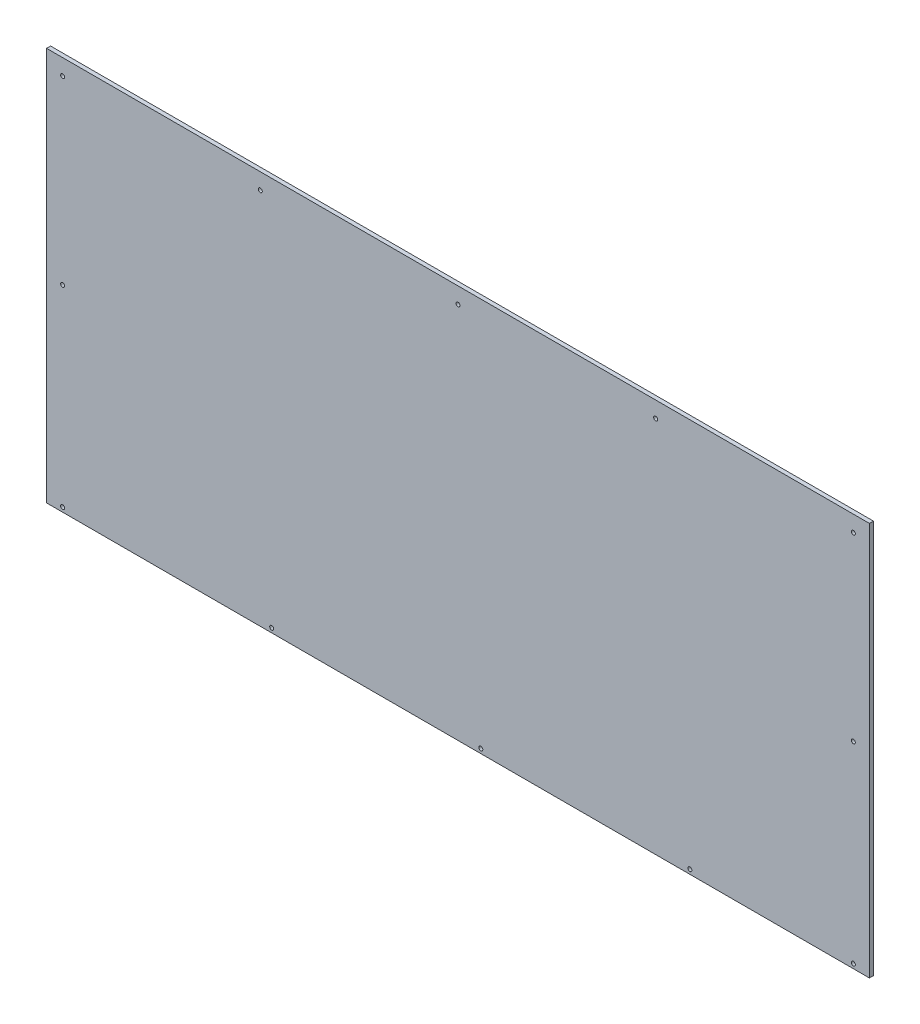
ISO-10303-21;
HEADER;
FILE_DESCRIPTION(('STEP AP214'),'2;1');
FILE_NAME('part.step','',(''),(''),'','','');
FILE_SCHEMA(('AUTOMOTIVE_DESIGN { 1 0 10303 214 1 1 1 1 }'));
ENDSEC;
DATA;
#1=APPLICATION_CONTEXT('core data for automotive mechanical design processes');
#2=APPLICATION_PROTOCOL_DEFINITION('international standard','automotive_design',2000,#1);
#3=PRODUCT_CONTEXT('',#1,'mechanical');
#4=PRODUCT('Part','Part','',(#3));
#5=PRODUCT_RELATED_PRODUCT_CATEGORY('part','',(#4));
#6=PRODUCT_DEFINITION_FORMATION('','',#4);
#7=PRODUCT_DEFINITION_CONTEXT('part definition',#1,'design');
#8=PRODUCT_DEFINITION('design','',#6,#7);
#9=PRODUCT_DEFINITION_SHAPE('','',#8);
#10=(LENGTH_UNIT() NAMED_UNIT(*) SI_UNIT(.MILLI.,.METRE.));
#11=(NAMED_UNIT(*) PLANE_ANGLE_UNIT() SI_UNIT($,.RADIAN.));
#12=(NAMED_UNIT(*) SI_UNIT($,.STERADIAN.) SOLID_ANGLE_UNIT());
#13=UNCERTAINTY_MEASURE_WITH_UNIT(LENGTH_MEASURE(1.E-05),#10,'distance_accuracy_value','');
#14=(GEOMETRIC_REPRESENTATION_CONTEXT(3) GLOBAL_UNCERTAINTY_ASSIGNED_CONTEXT((#13)) GLOBAL_UNIT_ASSIGNED_CONTEXT((#10,
#11,#12)) REPRESENTATION_CONTEXT('',''));
#15=CARTESIAN_POINT('',(0.,0.,0.));
#16=DIRECTION('',(0.,0.,1.));
#17=DIRECTION('',(1.,0.,0.));
#18=AXIS2_PLACEMENT_3D('',#15,#16,#17);
#19=CARTESIAN_POINT('',(650.,311.,6.35));
#20=DIRECTION('',(-1.,0.,0.));
#21=DIRECTION('',(0.,-1.,0.));
#22=AXIS2_PLACEMENT_3D('',#19,#20,#21);
#23=PLANE('',#22);
#24=DIRECTION('',(0.,1.,0.));
#25=VECTOR('',#24,1.);
#26=CARTESIAN_POINT('',(650.,311.,0.));
#27=LINE('',#26,#25);
#28=CARTESIAN_POINT('',(650.,-311.,0.));
#29=VERTEX_POINT('',#28);
#30=CARTESIAN_POINT('',(650.,311.,0.));
#31=VERTEX_POINT('',#30);
#32=EDGE_CURVE('E95',#29,#31,#27,.T.);
#33=ORIENTED_EDGE('',*,*,#32,.T.);
#34=DIRECTION('',(0.,0.,-1.));
#35=VECTOR('',#34,1.);
#36=CARTESIAN_POINT('',(650.,311.,6.35));
#37=LINE('',#36,#35);
#38=CARTESIAN_POINT('',(650.,311.,6.35));
#39=VERTEX_POINT('',#38);
#40=EDGE_CURVE('E11',#39,#31,#37,.T.);
#41=ORIENTED_EDGE('',*,*,#40,.F.);
#42=DIRECTION('',(0.,1.,0.));
#43=VECTOR('',#42,1.);
#44=CARTESIAN_POINT('',(650.,311.,6.35));
#45=LINE('',#44,#43);
#46=CARTESIAN_POINT('',(650.,-311.,6.35));
#47=VERTEX_POINT('',#46);
#48=EDGE_CURVE('E83',#47,#39,#45,.T.);
#49=ORIENTED_EDGE('',*,*,#48,.F.);
#50=DIRECTION('',(0.,0.,-1.));
#51=VECTOR('',#50,1.);
#52=CARTESIAN_POINT('',(650.,-311.,6.35));
#53=LINE('',#52,#51);
#54=EDGE_CURVE('E91',#47,#29,#53,.T.);
#55=ORIENTED_EDGE('',*,*,#54,.T.);
#56=EDGE_LOOP('',(#33,#41,#49,#55));
#57=FACE_BOUND('',#56,.T.);
#58=ADVANCED_FACE('F32',(#57),#23,.F.);
#59=CARTESIAN_POINT('',(-650.,311.,6.35));
#60=DIRECTION('',(0.,-1.,0.));
#61=DIRECTION('',(0.,0.,-1.));
#62=AXIS2_PLACEMENT_3D('',#59,#60,#61);
#63=PLANE('',#62);
#64=DIRECTION('',(-1.,0.,0.));
#65=VECTOR('',#64,1.);
#66=CARTESIAN_POINT('',(-650.,311.,0.));
#67=LINE('',#66,#65);
#68=CARTESIAN_POINT('',(-650.,311.,0.));
#69=VERTEX_POINT('',#68);
#70=EDGE_CURVE('E87',#31,#69,#67,.T.);
#71=ORIENTED_EDGE('',*,*,#70,.T.);
#72=DIRECTION('',(0.,0.,-1.));
#73=VECTOR('',#72,1.);
#74=CARTESIAN_POINT('',(-650.,311.,6.35));
#75=LINE('',#74,#73);
#76=CARTESIAN_POINT('',(-650.,311.,6.35));
#77=VERTEX_POINT('',#76);
#78=EDGE_CURVE('E40',#77,#69,#75,.T.);
#79=ORIENTED_EDGE('',*,*,#78,.F.);
#80=DIRECTION('',(-1.,0.,0.));
#81=VECTOR('',#80,1.);
#82=CARTESIAN_POINT('',(-650.,311.,6.35));
#83=LINE('',#82,#81);
#84=EDGE_CURVE('E78',#39,#77,#83,.T.);
#85=ORIENTED_EDGE('',*,*,#84,.F.);
#86=ORIENTED_EDGE('',*,*,#40,.T.);
#87=EDGE_LOOP('',(#71,#79,#85,#86));
#88=FACE_BOUND('',#87,.T.);
#89=ADVANCED_FACE('F86',(#88),#63,.F.);
#90=CARTESIAN_POINT('',(-650.,311.,6.35));
#91=DIRECTION('',(1.,0.,0.));
#92=DIRECTION('',(0.,1.,0.));
#93=AXIS2_PLACEMENT_3D('',#90,#91,#92);
#94=PLANE('',#93);
#95=DIRECTION('',(0.,-1.,0.));
#96=VECTOR('',#95,1.);
#97=CARTESIAN_POINT('',(-650.,311.,0.));
#98=LINE('',#97,#96);
#99=CARTESIAN_POINT('',(-650.,-311.,0.));
#100=VERTEX_POINT('',#99);
#101=EDGE_CURVE('E65',#69,#100,#98,.T.);
#102=ORIENTED_EDGE('',*,*,#101,.T.);
#103=DIRECTION('',(0.,0.,-1.));
#104=VECTOR('',#103,1.);
#105=CARTESIAN_POINT('',(-650.,-311.,6.35));
#106=LINE('',#105,#104);
#107=CARTESIAN_POINT('',(-650.,-311.,6.35));
#108=VERTEX_POINT('',#107);
#109=EDGE_CURVE('E88',#108,#100,#106,.T.);
#110=ORIENTED_EDGE('',*,*,#109,.F.);
#111=DIRECTION('',(0.,-1.,0.));
#112=VECTOR('',#111,1.);
#113=CARTESIAN_POINT('',(-650.,311.,6.35));
#114=LINE('',#113,#112);
#115=EDGE_CURVE('E81',#77,#108,#114,.T.);
#116=ORIENTED_EDGE('',*,*,#115,.F.);
#117=ORIENTED_EDGE('',*,*,#78,.T.);
#118=EDGE_LOOP('',(#102,#110,#116,#117));
#119=FACE_BOUND('',#118,.T.);
#120=ADVANCED_FACE('F89',(#119),#94,.F.);
#121=CARTESIAN_POINT('',(-650.,-311.,6.35));
#122=DIRECTION('',(0.,1.,0.));
#123=DIRECTION('',(0.,0.,1.));
#124=AXIS2_PLACEMENT_3D('',#121,#122,#123);
#125=PLANE('',#124);
#126=DIRECTION('',(1.,0.,0.));
#127=VECTOR('',#126,1.);
#128=CARTESIAN_POINT('',(-650.,-311.,0.));
#129=LINE('',#128,#127);
#130=EDGE_CURVE('E71',#100,#29,#129,.T.);
#131=ORIENTED_EDGE('',*,*,#130,.T.);
#132=ORIENTED_EDGE('',*,*,#54,.F.);
#133=DIRECTION('',(1.,0.,0.));
#134=VECTOR('',#133,1.);
#135=CARTESIAN_POINT('',(-650.,-311.,6.35));
#136=LINE('',#135,#134);
#137=EDGE_CURVE('E48',#108,#47,#136,.T.);
#138=ORIENTED_EDGE('',*,*,#137,.F.);
#139=ORIENTED_EDGE('',*,*,#109,.T.);
#140=EDGE_LOOP('',(#131,#132,#138,#139));
#141=FACE_BOUND('',#140,.T.);
#142=ADVANCED_FACE('F103',(#141),#125,.F.);
#143=CARTESIAN_POINT('',(0.,0.,6.35));
#144=DIRECTION('',(0.,0.,1.));
#145=DIRECTION('',(1.,0.,0.));
#146=AXIS2_PLACEMENT_3D('',#143,#144,#145);
#147=PLANE('',#146);
#148=CARTESIAN_POINT('',(624.6,0.,6.35));
#149=DIRECTION('',(0.,0.,1.));
#150=DIRECTION('',(-1.,0.,0.));
#151=AXIS2_PLACEMENT_3D('',#148,#149,#150);
#152=CIRCLE('',#151,3.17500000000008);
#153=CARTESIAN_POINT('',(621.425,0.,6.35));
#154=VERTEX_POINT('',#153);
#155=EDGE_CURVE('E158',#154,#154,#152,.T.);
#156=ORIENTED_EDGE('',*,*,#155,.F.);
#157=EDGE_LOOP('',(#156));
#158=FACE_BOUND('',#157,.T.);
#159=CARTESIAN_POINT('',(-624.6,-304.,6.35));
#160=DIRECTION('',(0.,0.,1.));
#161=DIRECTION('',(1.,0.,0.));
#162=AXIS2_PLACEMENT_3D('',#159,#160,#161);
#163=CIRCLE('',#162,3.17500000000008);
#164=CARTESIAN_POINT('',(-621.425,-304.,6.35));
#165=VERTEX_POINT('',#164);
#166=EDGE_CURVE('E152',#165,#165,#163,.T.);
#167=ORIENTED_EDGE('',*,*,#166,.F.);
#168=EDGE_LOOP('',(#167));
#169=FACE_BOUND('',#168,.T.);
#170=CARTESIAN_POINT('',(624.6,-304.,6.35));
#171=DIRECTION('',(0.,0.,1.));
#172=DIRECTION('',(-1.,0.,0.));
#173=AXIS2_PLACEMENT_3D('',#170,#171,#172);
#174=CIRCLE('',#173,3.17500000000008);
#175=CARTESIAN_POINT('',(621.425,-304.,6.35));
#176=VERTEX_POINT('',#175);
#177=EDGE_CURVE('E145',#176,#176,#174,.T.);
#178=ORIENTED_EDGE('',*,*,#177,.F.);
#179=EDGE_LOOP('',(#178));
#180=FACE_BOUND('',#179,.T.);
#181=CARTESIAN_POINT('',(-294.3,-304.,6.35));
#182=DIRECTION('',(0.,0.,1.));
#183=DIRECTION('',(1.,0.,0.));
#184=AXIS2_PLACEMENT_3D('',#181,#182,#183);
#185=CIRCLE('',#184,3.17500000000009);
#186=CARTESIAN_POINT('',(-291.125,-304.,6.35));
#187=VERTEX_POINT('',#186);
#188=EDGE_CURVE('E175',#187,#187,#185,.T.);
#189=ORIENTED_EDGE('',*,*,#188,.F.);
#190=EDGE_LOOP('',(#189));
#191=FACE_BOUND('',#190,.T.);
#192=CARTESIAN_POINT('',(36.0000000000001,-304.,6.35));
#193=DIRECTION('',(0.,0.,1.));
#194=DIRECTION('',(1.,0.,0.));
#195=AXIS2_PLACEMENT_3D('',#192,#193,#194);
#196=CIRCLE('',#195,3.17500000000006);
#197=CARTESIAN_POINT('',(39.1750000000002,-304.,6.35));
#198=VERTEX_POINT('',#197);
#199=EDGE_CURVE('E169',#198,#198,#196,.T.);
#200=ORIENTED_EDGE('',*,*,#199,.F.);
#201=EDGE_LOOP('',(#200));
#202=FACE_BOUND('',#201,.T.);
#203=CARTESIAN_POINT('',(366.3,-304.,6.35));
#204=DIRECTION('',(0.,0.,1.));
#205=DIRECTION('',(1.,0.,0.));
#206=AXIS2_PLACEMENT_3D('',#203,#204,#205);
#207=CIRCLE('',#206,3.17500000000009);
#208=CARTESIAN_POINT('',(369.475,-304.,6.35));
#209=VERTEX_POINT('',#208);
#210=EDGE_CURVE('E163',#209,#209,#207,.T.);
#211=ORIENTED_EDGE('',*,*,#210,.F.);
#212=EDGE_LOOP('',(#211));
#213=FACE_BOUND('',#212,.T.);
#214=CARTESIAN_POINT('',(624.6,285.6,6.35));
#215=DIRECTION('',(0.,0.,1.));
#216=DIRECTION('',(-1.,0.,0.));
#217=AXIS2_PLACEMENT_3D('',#214,#215,#216);
#218=CIRCLE('',#217,3.17500000000031);
#219=CARTESIAN_POINT('',(621.425,285.6,6.35));
#220=VERTEX_POINT('',#219);
#221=EDGE_CURVE('E122',#220,#220,#218,.T.);
#222=ORIENTED_EDGE('',*,*,#221,.F.);
#223=EDGE_LOOP('',(#222));
#224=FACE_BOUND('',#223,.T.);
#225=CARTESIAN_POINT('',(0.,285.6,6.35));
#226=DIRECTION('',(0.,0.,1.));
#227=DIRECTION('',(1.,0.,0.));
#228=AXIS2_PLACEMENT_3D('',#225,#226,#227);
#229=CIRCLE('',#228,3.175);
#230=CARTESIAN_POINT('',(3.175,285.6,6.35));
#231=VERTEX_POINT('',#230);
#232=EDGE_CURVE('E115',#231,#231,#229,.T.);
#233=ORIENTED_EDGE('',*,*,#232,.F.);
#234=EDGE_LOOP('',(#233));
#235=FACE_BOUND('',#234,.T.);
#236=CARTESIAN_POINT('',(-624.6,0.,6.35));
#237=DIRECTION('',(0.,0.,1.));
#238=DIRECTION('',(1.,0.,0.));
#239=AXIS2_PLACEMENT_3D('',#236,#237,#238);
#240=CIRCLE('',#239,3.17500000000008);
#241=CARTESIAN_POINT('',(-621.425,0.,6.35));
#242=VERTEX_POINT('',#241);
#243=EDGE_CURVE('E133',#242,#242,#240,.T.);
#244=ORIENTED_EDGE('',*,*,#243,.F.);
#245=EDGE_LOOP('',(#244));
#246=FACE_BOUND('',#245,.T.);
#247=CARTESIAN_POINT('',(312.3,285.6,6.35));
#248=DIRECTION('',(0.,0.,1.));
#249=DIRECTION('',(1.,0.,0.));
#250=AXIS2_PLACEMENT_3D('',#247,#248,#249);
#251=CIRCLE('',#250,3.17499999999997);
#252=CARTESIAN_POINT('',(315.475,285.6,6.35));
#253=VERTEX_POINT('',#252);
#254=EDGE_CURVE('E140',#253,#253,#251,.T.);
#255=ORIENTED_EDGE('',*,*,#254,.F.);
#256=EDGE_LOOP('',(#255));
#257=FACE_BOUND('',#256,.T.);
#258=CARTESIAN_POINT('',(-312.3,285.6,6.35));
#259=DIRECTION('',(0.,0.,1.));
#260=DIRECTION('',(1.,0.,0.));
#261=AXIS2_PLACEMENT_3D('',#258,#259,#260);
#262=CIRCLE('',#261,3.17499999999997);
#263=CARTESIAN_POINT('',(-309.125,285.6,6.35));
#264=VERTEX_POINT('',#263);
#265=EDGE_CURVE('E127',#264,#264,#262,.T.);
#266=ORIENTED_EDGE('',*,*,#265,.F.);
#267=EDGE_LOOP('',(#266));
#268=FACE_BOUND('',#267,.T.);
#269=CARTESIAN_POINT('',(-624.6,285.6,6.35));
#270=DIRECTION('',(0.,0.,1.));
#271=DIRECTION('',(1.,0.,0.));
#272=AXIS2_PLACEMENT_3D('',#269,#270,#271);
#273=CIRCLE('',#272,3.17500000000008);
#274=CARTESIAN_POINT('',(-621.425,285.6,6.35));
#275=VERTEX_POINT('',#274);
#276=EDGE_CURVE('E109',#275,#275,#273,.T.);
#277=ORIENTED_EDGE('',*,*,#276,.F.);
#278=EDGE_LOOP('',(#277));
#279=FACE_BOUND('',#278,.T.);
#280=ORIENTED_EDGE('',*,*,#48,.T.);
#281=ORIENTED_EDGE('',*,*,#84,.T.);
#282=ORIENTED_EDGE('',*,*,#115,.T.);
#283=ORIENTED_EDGE('',*,*,#137,.T.);
#284=EDGE_LOOP('',(#280,#281,#282,#283));
#285=FACE_BOUND('',#284,.T.);
#286=ADVANCED_FACE('F79',(#158,#169,#180,#191,#202,#213,#224,#235,#246,#257,#268,#279,#285),
#147,.T.);
#287=CARTESIAN_POINT('',(0.,0.,0.));
#288=DIRECTION('',(0.,0.,1.));
#289=DIRECTION('',(1.,0.,0.));
#290=AXIS2_PLACEMENT_3D('',#287,#288,#289);
#291=PLANE('',#290);
#292=CARTESIAN_POINT('',(624.6,0.,0.));
#293=DIRECTION('',(0.,0.,1.));
#294=DIRECTION('',(-1.,0.,0.));
#295=AXIS2_PLACEMENT_3D('',#292,#293,#294);
#296=CIRCLE('',#295,3.17500000000008);
#297=CARTESIAN_POINT('',(621.425,0.,0.));
#298=VERTEX_POINT('',#297);
#299=EDGE_CURVE('E137',#298,#298,#296,.T.);
#300=ORIENTED_EDGE('',*,*,#299,.T.);
#301=EDGE_LOOP('',(#300));
#302=FACE_BOUND('',#301,.T.);
#303=CARTESIAN_POINT('',(-624.6,-304.,0.));
#304=DIRECTION('',(0.,0.,1.));
#305=DIRECTION('',(1.,0.,0.));
#306=AXIS2_PLACEMENT_3D('',#303,#304,#305);
#307=CIRCLE('',#306,3.17500000000008);
#308=CARTESIAN_POINT('',(-621.425,-304.,0.));
#309=VERTEX_POINT('',#308);
#310=EDGE_CURVE('E155',#309,#309,#307,.T.);
#311=ORIENTED_EDGE('',*,*,#310,.T.);
#312=EDGE_LOOP('',(#311));
#313=FACE_BOUND('',#312,.T.);
#314=CARTESIAN_POINT('',(624.6,-304.,0.));
#315=DIRECTION('',(0.,0.,1.));
#316=DIRECTION('',(-1.,0.,0.));
#317=AXIS2_PLACEMENT_3D('',#314,#315,#316);
#318=CIRCLE('',#317,3.17500000000008);
#319=CARTESIAN_POINT('',(621.425,-304.,0.));
#320=VERTEX_POINT('',#319);
#321=EDGE_CURVE('E148',#320,#320,#318,.T.);
#322=ORIENTED_EDGE('',*,*,#321,.T.);
#323=EDGE_LOOP('',(#322));
#324=FACE_BOUND('',#323,.T.);
#325=CARTESIAN_POINT('',(-294.3,-304.,0.));
#326=DIRECTION('',(0.,0.,1.));
#327=DIRECTION('',(1.,0.,0.));
#328=AXIS2_PLACEMENT_3D('',#325,#326,#327);
#329=CIRCLE('',#328,3.17500000000009);
#330=CARTESIAN_POINT('',(-291.125,-304.,0.));
#331=VERTEX_POINT('',#330);
#332=EDGE_CURVE('E149',#331,#331,#329,.T.);
#333=ORIENTED_EDGE('',*,*,#332,.T.);
#334=EDGE_LOOP('',(#333));
#335=FACE_BOUND('',#334,.T.);
#336=CARTESIAN_POINT('',(36.0000000000001,-304.,0.));
#337=DIRECTION('',(0.,0.,1.));
#338=DIRECTION('',(1.,0.,0.));
#339=AXIS2_PLACEMENT_3D('',#336,#337,#338);
#340=CIRCLE('',#339,3.17500000000006);
#341=CARTESIAN_POINT('',(39.1750000000002,-304.,0.));
#342=VERTEX_POINT('',#341);
#343=EDGE_CURVE('E172',#342,#342,#340,.T.);
#344=ORIENTED_EDGE('',*,*,#343,.T.);
#345=EDGE_LOOP('',(#344));
#346=FACE_BOUND('',#345,.T.);
#347=CARTESIAN_POINT('',(366.3,-304.,0.));
#348=DIRECTION('',(0.,0.,1.));
#349=DIRECTION('',(1.,0.,0.));
#350=AXIS2_PLACEMENT_3D('',#347,#348,#349);
#351=CIRCLE('',#350,3.17500000000009);
#352=CARTESIAN_POINT('',(369.475,-304.,0.));
#353=VERTEX_POINT('',#352);
#354=EDGE_CURVE('E166',#353,#353,#351,.T.);
#355=ORIENTED_EDGE('',*,*,#354,.T.);
#356=EDGE_LOOP('',(#355));
#357=FACE_BOUND('',#356,.T.);
#358=CARTESIAN_POINT('',(624.6,285.6,0.));
#359=DIRECTION('',(0.,0.,1.));
#360=DIRECTION('',(-1.,0.,0.));
#361=AXIS2_PLACEMENT_3D('',#358,#359,#360);
#362=CIRCLE('',#361,3.17500000000031);
#363=CARTESIAN_POINT('',(621.425,285.6,0.));
#364=VERTEX_POINT('',#363);
#365=EDGE_CURVE('E112',#364,#364,#362,.T.);
#366=ORIENTED_EDGE('',*,*,#365,.T.);
#367=EDGE_LOOP('',(#366));
#368=FACE_BOUND('',#367,.T.);
#369=CARTESIAN_POINT('',(0.,285.6,0.));
#370=DIRECTION('',(0.,0.,1.));
#371=DIRECTION('',(1.,0.,0.));
#372=AXIS2_PLACEMENT_3D('',#369,#370,#371);
#373=CIRCLE('',#372,3.175);
#374=CARTESIAN_POINT('',(3.175,285.6,0.));
#375=VERTEX_POINT('',#374);
#376=EDGE_CURVE('E118',#375,#375,#373,.T.);
#377=ORIENTED_EDGE('',*,*,#376,.T.);
#378=EDGE_LOOP('',(#377));
#379=FACE_BOUND('',#378,.T.);
#380=CARTESIAN_POINT('',(-624.6,0.,0.));
#381=DIRECTION('',(0.,0.,1.));
#382=DIRECTION('',(1.,0.,0.));
#383=AXIS2_PLACEMENT_3D('',#380,#381,#382);
#384=CIRCLE('',#383,3.17500000000008);
#385=CARTESIAN_POINT('',(-621.425,0.,0.));
#386=VERTEX_POINT('',#385);
#387=EDGE_CURVE('E136',#386,#386,#384,.T.);
#388=ORIENTED_EDGE('',*,*,#387,.T.);
#389=EDGE_LOOP('',(#388));
#390=FACE_BOUND('',#389,.T.);
#391=CARTESIAN_POINT('',(312.3,285.6,0.));
#392=DIRECTION('',(0.,0.,1.));
#393=DIRECTION('',(1.,0.,0.));
#394=AXIS2_PLACEMENT_3D('',#391,#392,#393);
#395=CIRCLE('',#394,3.17499999999997);
#396=CARTESIAN_POINT('',(315.475,285.6,0.));
#397=VERTEX_POINT('',#396);
#398=EDGE_CURVE('E130',#397,#397,#395,.T.);
#399=ORIENTED_EDGE('',*,*,#398,.T.);
#400=EDGE_LOOP('',(#399));
#401=FACE_BOUND('',#400,.T.);
#402=CARTESIAN_POINT('',(-312.3,285.6,0.));
#403=DIRECTION('',(0.,0.,1.));
#404=DIRECTION('',(1.,0.,0.));
#405=AXIS2_PLACEMENT_3D('',#402,#403,#404);
#406=CIRCLE('',#405,3.17499999999997);
#407=CARTESIAN_POINT('',(-309.125,285.6,0.));
#408=VERTEX_POINT('',#407);
#409=EDGE_CURVE('E119',#408,#408,#406,.T.);
#410=ORIENTED_EDGE('',*,*,#409,.T.);
#411=EDGE_LOOP('',(#410));
#412=FACE_BOUND('',#411,.T.);
#413=CARTESIAN_POINT('',(-624.6,285.6,0.));
#414=DIRECTION('',(0.,0.,1.));
#415=DIRECTION('',(1.,0.,0.));
#416=AXIS2_PLACEMENT_3D('',#413,#414,#415);
#417=CIRCLE('',#416,3.17500000000008);
#418=CARTESIAN_POINT('',(-621.425,285.6,0.));
#419=VERTEX_POINT('',#418);
#420=EDGE_CURVE('E98',#419,#419,#417,.T.);
#421=ORIENTED_EDGE('',*,*,#420,.T.);
#422=EDGE_LOOP('',(#421));
#423=FACE_BOUND('',#422,.T.);
#424=ORIENTED_EDGE('',*,*,#32,.F.);
#425=ORIENTED_EDGE('',*,*,#130,.F.);
#426=ORIENTED_EDGE('',*,*,#101,.F.);
#427=ORIENTED_EDGE('',*,*,#70,.F.);
#428=EDGE_LOOP('',(#424,#425,#426,#427));
#429=FACE_BOUND('',#428,.T.);
#430=ADVANCED_FACE('F106',(#302,#313,#324,#335,#346,#357,#368,#379,#390,#401,#412,#423,#429),
#291,.F.);
#431=CARTESIAN_POINT('',(-624.6,285.6,0.));
#432=DIRECTION('',(0.,0.,1.));
#433=DIRECTION('',(1.,0.,0.));
#434=AXIS2_PLACEMENT_3D('',#431,#432,#433);
#435=CYLINDRICAL_SURFACE('',#434,3.17500000000008);
#436=ORIENTED_EDGE('',*,*,#420,.F.);
#437=EDGE_LOOP('',(#436));
#438=FACE_BOUND('',#437,.T.);
#439=ORIENTED_EDGE('',*,*,#276,.T.);
#440=EDGE_LOOP('',(#439));
#441=FACE_BOUND('',#440,.T.);
#442=ADVANCED_FACE('F211',(#438,#441),#435,.F.);
#443=CARTESIAN_POINT('',(-312.3,285.6,0.));
#444=DIRECTION('',(0.,0.,1.));
#445=DIRECTION('',(1.,0.,0.));
#446=AXIS2_PLACEMENT_3D('',#443,#444,#445);
#447=CYLINDRICAL_SURFACE('',#446,3.17499999999997);
#448=ORIENTED_EDGE('',*,*,#409,.F.);
#449=EDGE_LOOP('',(#448));
#450=FACE_BOUND('',#449,.T.);
#451=ORIENTED_EDGE('',*,*,#265,.T.);
#452=EDGE_LOOP('',(#451));
#453=FACE_BOUND('',#452,.T.);
#454=ADVANCED_FACE('F213',(#450,#453),#447,.F.);
#455=CARTESIAN_POINT('',(312.3,285.6,0.));
#456=DIRECTION('',(0.,0.,1.));
#457=DIRECTION('',(1.,0.,0.));
#458=AXIS2_PLACEMENT_3D('',#455,#456,#457);
#459=CYLINDRICAL_SURFACE('',#458,3.17499999999997);
#460=ORIENTED_EDGE('',*,*,#398,.F.);
#461=EDGE_LOOP('',(#460));
#462=FACE_BOUND('',#461,.T.);
#463=ORIENTED_EDGE('',*,*,#254,.T.);
#464=EDGE_LOOP('',(#463));
#465=FACE_BOUND('',#464,.T.);
#466=ADVANCED_FACE('F220',(#462,#465),#459,.F.);
#467=CARTESIAN_POINT('',(-624.6,0.,0.));
#468=DIRECTION('',(0.,0.,1.));
#469=DIRECTION('',(1.,0.,0.));
#470=AXIS2_PLACEMENT_3D('',#467,#468,#469);
#471=CYLINDRICAL_SURFACE('',#470,3.17500000000008);
#472=ORIENTED_EDGE('',*,*,#387,.F.);
#473=EDGE_LOOP('',(#472));
#474=FACE_BOUND('',#473,.T.);
#475=ORIENTED_EDGE('',*,*,#243,.T.);
#476=EDGE_LOOP('',(#475));
#477=FACE_BOUND('',#476,.T.);
#478=ADVANCED_FACE('F268',(#474,#477),#471,.F.);
#479=CARTESIAN_POINT('',(0.,285.6,0.));
#480=DIRECTION('',(0.,0.,1.));
#481=DIRECTION('',(1.,0.,0.));
#482=AXIS2_PLACEMENT_3D('',#479,#480,#481);
#483=CYLINDRICAL_SURFACE('',#482,3.175);
#484=ORIENTED_EDGE('',*,*,#376,.F.);
#485=EDGE_LOOP('',(#484));
#486=FACE_BOUND('',#485,.T.);
#487=ORIENTED_EDGE('',*,*,#232,.T.);
#488=EDGE_LOOP('',(#487));
#489=FACE_BOUND('',#488,.T.);
#490=ADVANCED_FACE('F278',(#486,#489),#483,.F.);
#491=CARTESIAN_POINT('',(624.6,285.6,0.));
#492=DIRECTION('',(0.,0.,1.));
#493=DIRECTION('',(1.,0.,0.));
#494=AXIS2_PLACEMENT_3D('',#491,#492,#493);
#495=CYLINDRICAL_SURFACE('',#494,3.17500000000031);
#496=ORIENTED_EDGE('',*,*,#365,.F.);
#497=EDGE_LOOP('',(#496));
#498=FACE_BOUND('',#497,.T.);
#499=ORIENTED_EDGE('',*,*,#221,.T.);
#500=EDGE_LOOP('',(#499));
#501=FACE_BOUND('',#500,.T.);
#502=ADVANCED_FACE('F288',(#498,#501),#495,.F.);
#503=CARTESIAN_POINT('',(366.3,-304.,0.));
#504=DIRECTION('',(0.,0.,1.));
#505=DIRECTION('',(1.,0.,0.));
#506=AXIS2_PLACEMENT_3D('',#503,#504,#505);
#507=CYLINDRICAL_SURFACE('',#506,3.17500000000009);
#508=ORIENTED_EDGE('',*,*,#354,.F.);
#509=EDGE_LOOP('',(#508));
#510=FACE_BOUND('',#509,.T.);
#511=ORIENTED_EDGE('',*,*,#210,.T.);
#512=EDGE_LOOP('',(#511));
#513=FACE_BOUND('',#512,.T.);
#514=ADVANCED_FACE('F297',(#510,#513),#507,.F.);
#515=CARTESIAN_POINT('',(36.0000000000001,-304.,0.));
#516=DIRECTION('',(0.,0.,1.));
#517=DIRECTION('',(1.,0.,0.));
#518=AXIS2_PLACEMENT_3D('',#515,#516,#517);
#519=CYLINDRICAL_SURFACE('',#518,3.17500000000006);
#520=ORIENTED_EDGE('',*,*,#343,.F.);
#521=EDGE_LOOP('',(#520));
#522=FACE_BOUND('',#521,.T.);
#523=ORIENTED_EDGE('',*,*,#199,.T.);
#524=EDGE_LOOP('',(#523));
#525=FACE_BOUND('',#524,.T.);
#526=ADVANCED_FACE('F187',(#522,#525),#519,.F.);
#527=CARTESIAN_POINT('',(-294.3,-304.,0.));
#528=DIRECTION('',(0.,0.,1.));
#529=DIRECTION('',(1.,0.,0.));
#530=AXIS2_PLACEMENT_3D('',#527,#528,#529);
#531=CYLINDRICAL_SURFACE('',#530,3.17500000000009);
#532=ORIENTED_EDGE('',*,*,#332,.F.);
#533=EDGE_LOOP('',(#532));
#534=FACE_BOUND('',#533,.T.);
#535=ORIENTED_EDGE('',*,*,#188,.T.);
#536=EDGE_LOOP('',(#535));
#537=FACE_BOUND('',#536,.T.);
#538=ADVANCED_FACE('F183',(#534,#537),#531,.F.);
#539=CARTESIAN_POINT('',(624.6,-304.,0.));
#540=DIRECTION('',(0.,0.,1.));
#541=DIRECTION('',(1.,0.,0.));
#542=AXIS2_PLACEMENT_3D('',#539,#540,#541);
#543=CYLINDRICAL_SURFACE('',#542,3.17500000000008);
#544=ORIENTED_EDGE('',*,*,#321,.F.);
#545=EDGE_LOOP('',(#544));
#546=FACE_BOUND('',#545,.T.);
#547=ORIENTED_EDGE('',*,*,#177,.T.);
#548=EDGE_LOOP('',(#547));
#549=FACE_BOUND('',#548,.T.);
#550=ADVANCED_FACE('F186',(#546,#549),#543,.F.);
#551=CARTESIAN_POINT('',(-624.6,-304.,0.));
#552=DIRECTION('',(0.,0.,1.));
#553=DIRECTION('',(1.,0.,0.));
#554=AXIS2_PLACEMENT_3D('',#551,#552,#553);
#555=CYLINDRICAL_SURFACE('',#554,3.17500000000008);
#556=ORIENTED_EDGE('',*,*,#310,.F.);
#557=EDGE_LOOP('',(#556));
#558=FACE_BOUND('',#557,.T.);
#559=ORIENTED_EDGE('',*,*,#166,.T.);
#560=EDGE_LOOP('',(#559));
#561=FACE_BOUND('',#560,.T.);
#562=ADVANCED_FACE('F331',(#558,#561),#555,.F.);
#563=CARTESIAN_POINT('',(624.6,0.,0.));
#564=DIRECTION('',(0.,0.,1.));
#565=DIRECTION('',(1.,0.,0.));
#566=AXIS2_PLACEMENT_3D('',#563,#564,#565);
#567=CYLINDRICAL_SURFACE('',#566,3.17500000000008);
#568=ORIENTED_EDGE('',*,*,#299,.F.);
#569=EDGE_LOOP('',(#568));
#570=FACE_BOUND('',#569,.T.);
#571=ORIENTED_EDGE('',*,*,#155,.T.);
#572=EDGE_LOOP('',(#571));
#573=FACE_BOUND('',#572,.T.);
#574=ADVANCED_FACE('F341',(#570,#573),#567,.F.);
#575=CLOSED_SHELL('',(#58,#89,#120,#142,#286,#430,#442,#454,#466,#478,#490,#502,#514,#526,#538,
#550,#562,#574));
#576=MANIFOLD_SOLID_BREP('B2',#575);
#577=ADVANCED_BREP_SHAPE_REPRESENTATION('',(#18,#576),#14);
#578=SHAPE_DEFINITION_REPRESENTATION(#9,#577);
ENDSEC;
END-ISO-10303-21;
